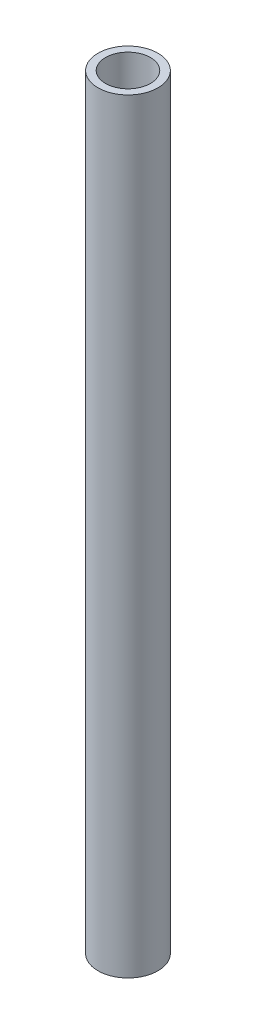
ISO-10303-21;
HEADER;
FILE_DESCRIPTION(('STEP AP214'),'2;1');
FILE_NAME('part.step','',(''),(''),'','','');
FILE_SCHEMA(('AUTOMOTIVE_DESIGN { 1 0 10303 214 1 1 1 1 }'));
ENDSEC;
DATA;
#1=APPLICATION_CONTEXT('core data for automotive mechanical design processes');
#2=APPLICATION_PROTOCOL_DEFINITION('international standard','automotive_design',2000,#1);
#3=PRODUCT_CONTEXT('',#1,'mechanical');
#4=PRODUCT('Part','Part','',(#3));
#5=PRODUCT_RELATED_PRODUCT_CATEGORY('part','',(#4));
#6=PRODUCT_DEFINITION_FORMATION('','',#4);
#7=PRODUCT_DEFINITION_CONTEXT('part definition',#1,'design');
#8=PRODUCT_DEFINITION('design','',#6,#7);
#9=PRODUCT_DEFINITION_SHAPE('','',#8);
#10=(LENGTH_UNIT() NAMED_UNIT(*) SI_UNIT(.MILLI.,.METRE.));
#11=(NAMED_UNIT(*) PLANE_ANGLE_UNIT() SI_UNIT($,.RADIAN.));
#12=(NAMED_UNIT(*) SI_UNIT($,.STERADIAN.) SOLID_ANGLE_UNIT());
#13=UNCERTAINTY_MEASURE_WITH_UNIT(LENGTH_MEASURE(1.E-05),#10,'distance_accuracy_value','');
#14=(GEOMETRIC_REPRESENTATION_CONTEXT(3) GLOBAL_UNCERTAINTY_ASSIGNED_CONTEXT((#13)) GLOBAL_UNIT_ASSIGNED_CONTEXT((#10,
#11,#12)) REPRESENTATION_CONTEXT('',''));
#15=CARTESIAN_POINT('',(0.,0.,0.));
#16=DIRECTION('',(0.,0.,1.));
#17=DIRECTION('',(1.,0.,0.));
#18=AXIS2_PLACEMENT_3D('',#15,#16,#17);
#19=CARTESIAN_POINT('',(0.,102.,0.));
#20=DIRECTION('',(0.,1.,0.));
#21=DIRECTION('',(0.,0.,1.));
#22=AXIS2_PLACEMENT_3D('',#19,#20,#21);
#23=PLANE('',#22);
#24=CARTESIAN_POINT('',(0.,102.,0.));
#25=DIRECTION('',(0.,1.,0.));
#26=DIRECTION('',(0.,0.,1.));
#27=AXIS2_PLACEMENT_3D('',#24,#25,#26);
#28=CIRCLE('',#27,4.);
#29=CARTESIAN_POINT('',(0.,102.,4.));
#30=VERTEX_POINT('',#29);
#31=EDGE_CURVE('E10',#30,#30,#28,.T.);
#32=ORIENTED_EDGE('',*,*,#31,.T.);
#33=EDGE_LOOP('',(#32));
#34=FACE_BOUND('',#33,.T.);
#35=CARTESIAN_POINT('',(0.,102.,0.));
#36=DIRECTION('',(0.,1.,0.));
#37=DIRECTION('',(0.,0.,1.));
#38=AXIS2_PLACEMENT_3D('',#35,#36,#37);
#39=CIRCLE('',#38,3.);
#40=CARTESIAN_POINT('',(0.,102.,3.));
#41=VERTEX_POINT('',#40);
#42=EDGE_CURVE('E48',#41,#41,#39,.T.);
#43=ORIENTED_EDGE('',*,*,#42,.F.);
#44=EDGE_LOOP('',(#43));
#45=FACE_BOUND('',#44,.T.);
#46=ADVANCED_FACE('F37',(#34,#45),#23,.T.);
#47=CARTESIAN_POINT('',(0.,0.,0.));
#48=DIRECTION('',(0.,1.,0.));
#49=DIRECTION('',(0.,0.,1.));
#50=AXIS2_PLACEMENT_3D('',#47,#48,#49);
#51=PLANE('',#50);
#52=CARTESIAN_POINT('',(0.,0.,0.));
#53=DIRECTION('',(0.,1.,0.));
#54=DIRECTION('',(0.,0.,1.));
#55=AXIS2_PLACEMENT_3D('',#52,#53,#54);
#56=CIRCLE('',#55,4.);
#57=CARTESIAN_POINT('',(0.,0.,4.));
#58=VERTEX_POINT('',#57);
#59=EDGE_CURVE('E41',#58,#58,#56,.T.);
#60=ORIENTED_EDGE('',*,*,#59,.F.);
#61=EDGE_LOOP('',(#60));
#62=FACE_BOUND('',#61,.T.);
#63=CARTESIAN_POINT('',(0.,0.,0.));
#64=DIRECTION('',(0.,1.,0.));
#65=DIRECTION('',(0.,0.,1.));
#66=AXIS2_PLACEMENT_3D('',#63,#64,#65);
#67=CIRCLE('',#66,3.);
#68=CARTESIAN_POINT('',(0.,0.,3.));
#69=VERTEX_POINT('',#68);
#70=EDGE_CURVE('E50',#69,#69,#67,.T.);
#71=ORIENTED_EDGE('',*,*,#70,.T.);
#72=EDGE_LOOP('',(#71));
#73=FACE_BOUND('',#72,.T.);
#74=ADVANCED_FACE('F60',(#62,#73),#51,.F.);
#75=CARTESIAN_POINT('',(0.,102.,0.));
#76=DIRECTION('',(0.,-1.,0.));
#77=DIRECTION('',(0.,0.,-1.));
#78=AXIS2_PLACEMENT_3D('',#75,#76,#77);
#79=CYLINDRICAL_SURFACE('',#78,4.);
#80=ORIENTED_EDGE('',*,*,#31,.F.);
#81=EDGE_LOOP('',(#80));
#82=FACE_BOUND('',#81,.T.);
#83=ORIENTED_EDGE('',*,*,#59,.T.);
#84=EDGE_LOOP('',(#83));
#85=FACE_BOUND('',#84,.T.);
#86=ADVANCED_FACE('F39',(#82,#85),#79,.T.);
#87=CARTESIAN_POINT('',(0.,102.,0.));
#88=DIRECTION('',(0.,-1.,0.));
#89=DIRECTION('',(0.,0.,-1.));
#90=AXIS2_PLACEMENT_3D('',#87,#88,#89);
#91=CYLINDRICAL_SURFACE('',#90,3.);
#92=ORIENTED_EDGE('',*,*,#42,.T.);
#93=EDGE_LOOP('',(#92));
#94=FACE_BOUND('',#93,.T.);
#95=ORIENTED_EDGE('',*,*,#70,.F.);
#96=EDGE_LOOP('',(#95));
#97=FACE_BOUND('',#96,.T.);
#98=ADVANCED_FACE('F56',(#94,#97),#91,.F.);
#99=CLOSED_SHELL('',(#46,#74,#86,#98));
#100=MANIFOLD_SOLID_BREP('B2',#99);
#101=ADVANCED_BREP_SHAPE_REPRESENTATION('',(#18,#100),#14);
#102=SHAPE_DEFINITION_REPRESENTATION(#9,#101);
ENDSEC;
END-ISO-10303-21;
